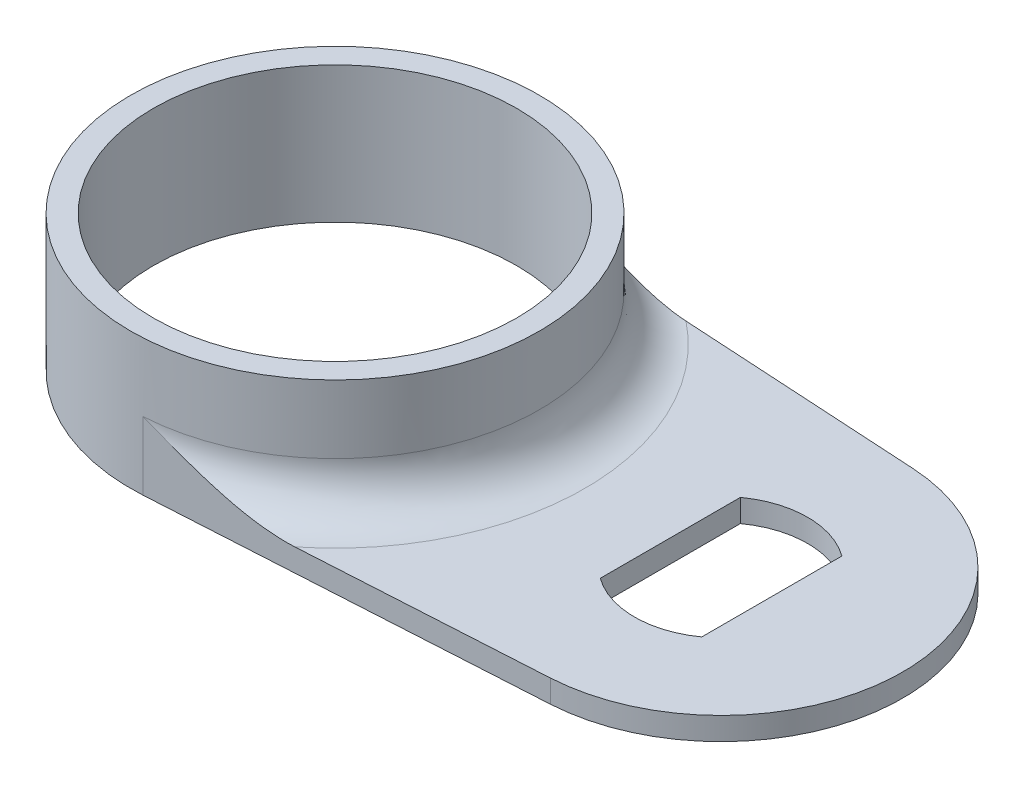
ISO-10303-21;
HEADER;
FILE_DESCRIPTION(('STEP AP214'),'2;1');
FILE_NAME('part.step','',(''),(''),'','','');
FILE_SCHEMA(('AUTOMOTIVE_DESIGN { 1 0 10303 214 1 1 1 1 }'));
ENDSEC;
DATA;
#1=APPLICATION_CONTEXT('core data for automotive mechanical design processes');
#2=APPLICATION_PROTOCOL_DEFINITION('international standard','automotive_design',2000,#1);
#3=PRODUCT_CONTEXT('',#1,'mechanical');
#4=PRODUCT('Part','Part','',(#3));
#5=PRODUCT_RELATED_PRODUCT_CATEGORY('part','',(#4));
#6=PRODUCT_DEFINITION_FORMATION('','',#4);
#7=PRODUCT_DEFINITION_CONTEXT('part definition',#1,'design');
#8=PRODUCT_DEFINITION('design','',#6,#7);
#9=PRODUCT_DEFINITION_SHAPE('','',#8);
#10=(LENGTH_UNIT() NAMED_UNIT(*) SI_UNIT(.MILLI.,.METRE.));
#11=(NAMED_UNIT(*) PLANE_ANGLE_UNIT() SI_UNIT($,.RADIAN.));
#12=(NAMED_UNIT(*) SI_UNIT($,.STERADIAN.) SOLID_ANGLE_UNIT());
#13=UNCERTAINTY_MEASURE_WITH_UNIT(LENGTH_MEASURE(1.E-05),#10,'distance_accuracy_value','');
#14=(GEOMETRIC_REPRESENTATION_CONTEXT(3) GLOBAL_UNCERTAINTY_ASSIGNED_CONTEXT((#13)) GLOBAL_UNIT_ASSIGNED_CONTEXT((#10,
#11,#12)) REPRESENTATION_CONTEXT('',''));
#15=CARTESIAN_POINT('',(0.,0.,0.));
#16=DIRECTION('',(0.,0.,1.));
#17=DIRECTION('',(1.,0.,0.));
#18=AXIS2_PLACEMENT_3D('',#15,#16,#17);
#19=CARTESIAN_POINT('',(-85.,5.,0.));
#20=DIRECTION('',(0.,1.,0.));
#21=DIRECTION('',(0.,0.,1.));
#22=AXIS2_PLACEMENT_3D('',#19,#20,#21);
#23=PLANE('',#22);
#24=DIRECTION('',(-0.998268396969244,0.,-0.0588235294117646));
#25=VECTOR('',#24,1.);
#26=CARTESIAN_POINT('',(-82.3529411764706,5.,-44.922077863616));
#27=LINE('',#26,#25);
#28=CARTESIAN_POINT('',(2.35294117647059,5.,-39.9307358787697));
#29=VERTEX_POINT('',#28);
#30=CARTESIAN_POINT('',(-50.7849226705912,5.,-43.0619145341051));
#31=VERTEX_POINT('',#30);
#32=EDGE_CURVE('E159',#29,#31,#27,.T.);
#33=ORIENTED_EDGE('',*,*,#32,.T.);
#34=CARTESIAN_POINT('',(-85.,5.,0.));
#35=DIRECTION('',(0.,1.,0.));
#36=DIRECTION('',(0.,0.,1.));
#37=AXIS2_PLACEMENT_3D('',#34,#35,#36);
#38=CIRCLE('',#37,55.);
#39=CARTESIAN_POINT('',(-50.7849226705912,5.,43.0619145341051));
#40=VERTEX_POINT('',#39);
#41=EDGE_CURVE('E60',#31,#40,#38,.F.);
#42=ORIENTED_EDGE('',*,*,#41,.T.);
#43=DIRECTION('',(0.998268396969244,0.,-0.0588235294117647));
#44=VECTOR('',#43,1.);
#45=CARTESIAN_POINT('',(-82.3529411764706,5.,44.922077863616));
#46=LINE('',#45,#44);
#47=CARTESIAN_POINT('',(2.35294117647059,5.,39.9307358787697));
#48=VERTEX_POINT('',#47);
#49=EDGE_CURVE('E154',#40,#48,#46,.T.);
#50=ORIENTED_EDGE('',*,*,#49,.T.);
#51=CARTESIAN_POINT('',(0.,5.,0.));
#52=DIRECTION('',(0.,1.,0.));
#53=DIRECTION('',(0.,0.,1.));
#54=AXIS2_PLACEMENT_3D('',#51,#52,#53);
#55=CIRCLE('',#54,40.);
#56=EDGE_CURVE('E156',#48,#29,#55,.T.);
#57=ORIENTED_EDGE('',*,*,#56,.T.);
#58=EDGE_LOOP('',(#33,#42,#50,#57));
#59=FACE_BOUND('',#58,.T.);
#60=DIRECTION('',(0.,0.,1.));
#61=VECTOR('',#60,1.);
#62=CARTESIAN_POINT('',(-11.1790820285031,5.,-15.425));
#63=LINE('',#62,#61);
#64=CARTESIAN_POINT('',(-11.1790820285031,5.,-15.425));
#65=VERTEX_POINT('',#64);
#66=CARTESIAN_POINT('',(-11.1790820285031,5.,15.425));
#67=VERTEX_POINT('',#66);
#68=EDGE_CURVE('E121',#65,#67,#63,.T.);
#69=ORIENTED_EDGE('',*,*,#68,.F.);
#70=CARTESIAN_POINT('',(0.,5.,0.));
#71=DIRECTION('',(0.,1.,0.));
#72=DIRECTION('',(0.,0.,1.));
#73=AXIS2_PLACEMENT_3D('',#70,#71,#72);
#74=CIRCLE('',#73,19.05);
#75=CARTESIAN_POINT('',(11.1790820285031,5.,-15.425));
#76=VERTEX_POINT('',#75);
#77=EDGE_CURVE('E111',#76,#65,#74,.T.);
#78=ORIENTED_EDGE('',*,*,#77,.F.);
#79=DIRECTION('',(0.,0.,-1.));
#80=VECTOR('',#79,1.);
#81=CARTESIAN_POINT('',(11.1790820285031,5.,15.425));
#82=LINE('',#81,#80);
#83=CARTESIAN_POINT('',(11.1790820285031,5.,15.425));
#84=VERTEX_POINT('',#83);
#85=EDGE_CURVE('E136',#84,#76,#82,.T.);
#86=ORIENTED_EDGE('',*,*,#85,.F.);
#87=CARTESIAN_POINT('',(0.,5.,0.));
#88=DIRECTION('',(0.,1.,0.));
#89=DIRECTION('',(0.,0.,1.));
#90=AXIS2_PLACEMENT_3D('',#87,#88,#89);
#91=CIRCLE('',#90,19.05);
#92=EDGE_CURVE('E134',#67,#84,#91,.T.);
#93=ORIENTED_EDGE('',*,*,#92,.F.);
#94=EDGE_LOOP('',(#69,#78,#86,#93));
#95=FACE_BOUND('',#94,.T.);
#96=ADVANCED_FACE('F33',(#59,#95),#23,.T.);
#97=CARTESIAN_POINT('',(-85.,0.,0.));
#98=DIRECTION('',(0.,1.,0.));
#99=DIRECTION('',(0.,0.,1.));
#100=AXIS2_PLACEMENT_3D('',#97,#98,#99);
#101=PLANE('',#100);
#102=CARTESIAN_POINT('',(-85.,0.,0.));
#103=DIRECTION('',(0.,1.,0.));
#104=DIRECTION('',(0.,0.,1.));
#105=AXIS2_PLACEMENT_3D('',#102,#103,#104);
#106=CIRCLE('',#105,45.);
#107=CARTESIAN_POINT('',(-82.3529411764706,0.,-44.922077863616));
#108=VERTEX_POINT('',#107);
#109=CARTESIAN_POINT('',(-82.3529411764706,0.,44.922077863616));
#110=VERTEX_POINT('',#109);
#111=EDGE_CURVE('E129',#108,#110,#106,.T.);
#112=ORIENTED_EDGE('',*,*,#111,.F.);
#113=DIRECTION('',(-0.998268396969244,0.,-0.0588235294117646));
#114=VECTOR('',#113,1.);
#115=CARTESIAN_POINT('',(-82.3529411764706,0.,-44.922077863616));
#116=LINE('',#115,#114);
#117=CARTESIAN_POINT('',(2.35294117647059,0.,-39.9307358787697));
#118=VERTEX_POINT('',#117);
#119=EDGE_CURVE('E157',#118,#108,#116,.T.);
#120=ORIENTED_EDGE('',*,*,#119,.F.);
#121=CARTESIAN_POINT('',(0.,0.,0.));
#122=DIRECTION('',(0.,1.,0.));
#123=DIRECTION('',(0.,0.,1.));
#124=AXIS2_PLACEMENT_3D('',#121,#122,#123);
#125=CIRCLE('',#124,40.);
#126=CARTESIAN_POINT('',(2.35294117647059,0.,39.9307358787697));
#127=VERTEX_POINT('',#126);
#128=EDGE_CURVE('E166',#127,#118,#125,.T.);
#129=ORIENTED_EDGE('',*,*,#128,.F.);
#130=DIRECTION('',(0.998268396969244,0.,-0.0588235294117647));
#131=VECTOR('',#130,1.);
#132=CARTESIAN_POINT('',(-82.3529411764706,0.,44.922077863616));
#133=LINE('',#132,#131);
#134=EDGE_CURVE('E164',#110,#127,#133,.T.);
#135=ORIENTED_EDGE('',*,*,#134,.F.);
#136=EDGE_LOOP('',(#112,#120,#129,#135));
#137=FACE_BOUND('',#136,.T.);
#138=CARTESIAN_POINT('',(0.,0.,0.));
#139=DIRECTION('',(0.,1.,0.));
#140=DIRECTION('',(0.,0.,1.));
#141=AXIS2_PLACEMENT_3D('',#138,#139,#140);
#142=CIRCLE('',#141,19.05);
#143=CARTESIAN_POINT('',(11.1790820285031,0.,-15.425));
#144=VERTEX_POINT('',#143);
#145=CARTESIAN_POINT('',(-11.1790820285031,0.,-15.425));
#146=VERTEX_POINT('',#145);
#147=EDGE_CURVE('E141',#144,#146,#142,.T.);
#148=ORIENTED_EDGE('',*,*,#147,.T.);
#149=DIRECTION('',(0.,0.,1.));
#150=VECTOR('',#149,1.);
#151=CARTESIAN_POINT('',(-11.1790820285031,0.,-15.425));
#152=LINE('',#151,#150);
#153=CARTESIAN_POINT('',(-11.1790820285031,0.,15.425));
#154=VERTEX_POINT('',#153);
#155=EDGE_CURVE('E128',#146,#154,#152,.T.);
#156=ORIENTED_EDGE('',*,*,#155,.T.);
#157=CARTESIAN_POINT('',(0.,0.,0.));
#158=DIRECTION('',(0.,1.,0.));
#159=DIRECTION('',(0.,0.,1.));
#160=AXIS2_PLACEMENT_3D('',#157,#158,#159);
#161=CIRCLE('',#160,19.05);
#162=CARTESIAN_POINT('',(11.1790820285031,0.,15.425));
#163=VERTEX_POINT('',#162);
#164=EDGE_CURVE('E145',#154,#163,#161,.T.);
#165=ORIENTED_EDGE('',*,*,#164,.T.);
#166=DIRECTION('',(0.,0.,-1.));
#167=VECTOR('',#166,1.);
#168=CARTESIAN_POINT('',(11.1790820285031,0.,15.425));
#169=LINE('',#168,#167);
#170=EDGE_CURVE('E122',#163,#144,#169,.T.);
#171=ORIENTED_EDGE('',*,*,#170,.T.);
#172=EDGE_LOOP('',(#148,#156,#165,#171));
#173=FACE_BOUND('',#172,.T.);
#174=CARTESIAN_POINT('',(-85.,0.,0.));
#175=DIRECTION('',(0.,1.,0.));
#176=DIRECTION('',(0.,0.,1.));
#177=AXIS2_PLACEMENT_3D('',#174,#175,#176);
#178=CIRCLE('',#177,40.);
#179=CARTESIAN_POINT('',(-85.,0.,40.));
#180=VERTEX_POINT('',#179);
#181=EDGE_CURVE('E143',#180,#180,#178,.T.);
#182=ORIENTED_EDGE('',*,*,#181,.T.);
#183=EDGE_LOOP('',(#182));
#184=FACE_BOUND('',#183,.T.);
#185=ADVANCED_FACE('F194',(#137,#173,#184),#101,.F.);
#186=CARTESIAN_POINT('',(-85.,5.,0.));
#187=DIRECTION('',(0.,-1.,0.));
#188=DIRECTION('',(0.,0.,-1.));
#189=AXIS2_PLACEMENT_3D('',#186,#187,#188);
#190=CYLINDRICAL_SURFACE('',#189,45.);
#191=CARTESIAN_POINT('',(-85.,15.,0.));
#192=DIRECTION('',(0.,1.,0.));
#193=DIRECTION('',(0.,0.,1.));
#194=AXIS2_PLACEMENT_3D('',#191,#192,#193);
#195=CIRCLE('',#194,45.);
#196=CARTESIAN_POINT('',(-82.3529411764706,15.,44.922077863616));
#197=VERTEX_POINT('',#196);
#198=CARTESIAN_POINT('',(-82.3529411764706,15.,-44.922077863616));
#199=VERTEX_POINT('',#198);
#200=EDGE_CURVE('E180',#197,#199,#195,.T.);
#201=ORIENTED_EDGE('',*,*,#200,.T.);
#202=DIRECTION('',(0.,-1.,0.));
#203=VECTOR('',#202,1.);
#204=CARTESIAN_POINT('',(-82.3529411764706,5.,-44.922077863616));
#205=LINE('',#204,#203);
#206=EDGE_CURVE('E161',#199,#108,#205,.T.);
#207=ORIENTED_EDGE('',*,*,#206,.T.);
#208=ORIENTED_EDGE('',*,*,#111,.T.);
#209=DIRECTION('',(0.,-1.,0.));
#210=VECTOR('',#209,1.);
#211=CARTESIAN_POINT('',(-82.3529411764706,5.,44.922077863616));
#212=LINE('',#211,#210);
#213=EDGE_CURVE('E177',#197,#110,#212,.T.);
#214=ORIENTED_EDGE('',*,*,#213,.F.);
#215=EDGE_LOOP('',(#201,#207,#208,#214));
#216=FACE_BOUND('',#215,.T.);
#217=CARTESIAN_POINT('',(-85.,30.,0.));
#218=DIRECTION('',(0.,1.,0.));
#219=DIRECTION('',(0.,0.,1.));
#220=AXIS2_PLACEMENT_3D('',#217,#218,#219);
#221=CIRCLE('',#220,45.);
#222=CARTESIAN_POINT('',(-85.,30.,45.));
#223=VERTEX_POINT('',#222);
#224=EDGE_CURVE('E240',#223,#223,#221,.T.);
#225=ORIENTED_EDGE('',*,*,#224,.F.);
#226=EDGE_LOOP('',(#225));
#227=FACE_BOUND('',#226,.T.);
#228=ADVANCED_FACE('F201',(#216,#227),#190,.T.);
#229=CARTESIAN_POINT('',(-82.3529411764706,5.,44.922077863616));
#230=DIRECTION('',(-0.0588235294117647,0.,-0.998268396969244));
#231=DIRECTION('',(-0.998268396969244,0.,0.0588235294117647));
#232=AXIS2_PLACEMENT_3D('',#229,#230,#231);
#233=PLANE('',#232);
#234=ORIENTED_EDGE('',*,*,#134,.T.);
#235=DIRECTION('',(0.,-1.,0.));
#236=VECTOR('',#235,1.);
#237=CARTESIAN_POINT('',(2.35294117647059,5.,39.9307358787697));
#238=LINE('',#237,#236);
#239=EDGE_CURVE('E174',#48,#127,#238,.T.);
#240=ORIENTED_EDGE('',*,*,#239,.F.);
#241=ORIENTED_EDGE('',*,*,#49,.F.);
#242=CARTESIAN_POINT('',(-50.7849226705912,5.,43.0619145341051));
#243=CARTESIAN_POINT('',(-51.07127392791,5.0000039839609,43.0787879437594));
#244=CARTESIAN_POINT('',(-51.3576027062524,5.00407965986606,43.0956600288273));
#245=CARTESIAN_POINT('',(-51.930021403472,5.01995827800982,43.1293901240342));
#246=CARTESIAN_POINT('',(-52.2161113423793,5.03176048936591,43.1462481353534));
#247=CARTESIAN_POINT('',(-53.0734577657511,5.0781148574327,43.1967677578361));
#248=CARTESIAN_POINT('',(-53.6441473941757,5.12361579266139,43.2303959666871));
#249=CARTESIAN_POINT('',(-54.7811192067368,5.24064224992738,43.2973926732437));
#250=CARTESIAN_POINT('',(-55.3474093668598,5.31209206375101,43.3307616409389));
#251=CARTESIAN_POINT('',(-56.4766228392769,5.47838498331519,43.3973011829183));
#252=CARTESIAN_POINT('',(-57.0395456000933,5.57323181885659,43.4304717247065));
#253=CARTESIAN_POINT('',(-58.1546650008146,5.78263949188636,43.4961807655467));
#254=CARTESIAN_POINT('',(-58.7069090892008,5.89694851405206,43.5287220605274));
#255=CARTESIAN_POINT('',(-59.8072986121974,6.1439691365389,43.5935631349988));
#256=CARTESIAN_POINT('',(-60.3554436690129,6.27668241161763,43.6258628922278));
#257=CARTESIAN_POINT('',(-61.9942950670852,6.69973461732017,43.7224331369723));
#258=CARTESIAN_POINT('',(-63.0786798932216,7.01484225733573,43.7863311256371));
#259=CARTESIAN_POINT('',(-64.9360933599235,7.60414710698417,43.8957802637848));
#260=CARTESIAN_POINT('',(-65.713136690904,7.86595005839312,43.9415679811691));
#261=CARTESIAN_POINT('',(-67.2590486997179,8.412887035449,44.0326617198816));
#262=CARTESIAN_POINT('',(-68.0279168743145,8.69802248808349,44.0779677115562));
#263=CARTESIAN_POINT('',(-69.5581436323627,9.28753446461466,44.1681371880037));
#264=CARTESIAN_POINT('',(-70.3195028592462,9.59190932305775,44.213000710691));
#265=CARTESIAN_POINT('',(-71.8358336310923,10.216272432596,44.3023513582989));
#266=CARTESIAN_POINT('',(-72.590804867416,10.5362614330986,44.3468384650326));
#267=CARTESIAN_POINT('',(-74.8527596163319,11.5166273886488,44.4801254268406));
#268=CARTESIAN_POINT('',(-76.3517559474309,12.1954148359654,44.5684546327317));
#269=CARTESIAN_POINT('',(-79.3387257014215,13.5767378334647,44.7444635134189));
#270=CARTESIAN_POINT('',(-80.8266982778496,14.2792751847179,44.8321431383367));
#271=CARTESIAN_POINT('',(-82.3274013914002,14.9879395464988,44.9205729173482));
#272=CARTESIAN_POINT('',(-82.3401712836371,14.9939697733995,44.9213253904645));
#273=CARTESIAN_POINT('',(-82.3529411764706,15.,44.922077863616));
#274=B_SPLINE_CURVE_WITH_KNOTS('',3,(#242,#243,#244,#245,#246,#247,#248,#249,#250,#251,#252,
#253,#254,#255,#256,#257,#258,#259,#260,#261,#262,#263,#264,#265,#266,#267,#268,#269,#270,#271,
#272,#273),.UNSPECIFIED.,.F.,.F.,(4,2,2,2,2,2,2,2,2,2,2,2,2,2,2,4),(0.,0.860476727147888,
1.72087207027274,3.44059261867407,5.15533551219946,6.87035193572028,8.56466424763826,
10.2591308405629,13.6503186246873,16.1136941408424,18.5772204268263,21.040533749646,
23.5039654167536,28.4470649294398,33.3905401459719,33.4329665528433),.UNSPECIFIED.);
#275=EDGE_CURVE('E11',#40,#197,#274,.T.);
#276=ORIENTED_EDGE('',*,*,#275,.T.);
#277=ORIENTED_EDGE('',*,*,#213,.T.);
#278=EDGE_LOOP('',(#234,#240,#241,#276,#277));
#279=FACE_BOUND('',#278,.T.);
#280=ADVANCED_FACE('F197',(#279),#233,.F.);
#281=CARTESIAN_POINT('',(0.,5.,0.));
#282=DIRECTION('',(0.,-1.,0.));
#283=DIRECTION('',(0.,0.,-1.));
#284=AXIS2_PLACEMENT_3D('',#281,#282,#283);
#285=CYLINDRICAL_SURFACE('',#284,40.);
#286=ORIENTED_EDGE('',*,*,#128,.T.);
#287=DIRECTION('',(0.,-1.,0.));
#288=VECTOR('',#287,1.);
#289=CARTESIAN_POINT('',(2.35294117647059,5.,-39.9307358787697));
#290=LINE('',#289,#288);
#291=EDGE_CURVE('E171',#29,#118,#290,.T.);
#292=ORIENTED_EDGE('',*,*,#291,.F.);
#293=ORIENTED_EDGE('',*,*,#56,.F.);
#294=ORIENTED_EDGE('',*,*,#239,.T.);
#295=EDGE_LOOP('',(#286,#292,#293,#294));
#296=FACE_BOUND('',#295,.T.);
#297=ADVANCED_FACE('F193',(#296),#285,.T.);
#298=CARTESIAN_POINT('',(-82.3529411764706,5.,-44.922077863616));
#299=DIRECTION('',(-0.0588235294117646,0.,0.998268396969244));
#300=DIRECTION('',(0.998268396969244,0.,0.0588235294117646));
#301=AXIS2_PLACEMENT_3D('',#298,#299,#300);
#302=PLANE('',#301);
#303=ORIENTED_EDGE('',*,*,#119,.T.);
#304=ORIENTED_EDGE('',*,*,#206,.F.);
#305=CARTESIAN_POINT('',(-50.7849226705912,5.,-43.0619145341051));
#306=CARTESIAN_POINT('',(-51.0712739279108,5.0000039839609,-43.0787879437595));
#307=CARTESIAN_POINT('',(-51.357602706254,5.00407965986608,-43.0956600288274));
#308=CARTESIAN_POINT('',(-51.9300214034752,5.01995827800994,-43.1293901240344));
#309=CARTESIAN_POINT('',(-52.2161113423833,5.03176048936609,-43.1462481353536));
#310=CARTESIAN_POINT('',(-53.0734577657576,5.07811485743313,-43.1967677578364));
#311=CARTESIAN_POINT('',(-53.6441473941838,5.12361579266207,-43.2303959666875));
#312=CARTESIAN_POINT('',(-54.7811192067478,5.24064224992866,-43.2973926732444));
#313=CARTESIAN_POINT('',(-55.347409366872,5.31209206375262,-43.3307616409396));
#314=CARTESIAN_POINT('',(-56.4766228392917,5.47838498331755,-43.3973011829192));
#315=CARTESIAN_POINT('',(-57.0395456001092,5.57323181885937,-43.4304717247074));
#316=CARTESIAN_POINT('',(-58.1546650008301,5.7826394918895,-43.4961807655476));
#317=CARTESIAN_POINT('',(-58.7069090892148,5.89694851405507,-43.5287220605282));
#318=CARTESIAN_POINT('',(-59.8072986122084,6.14396913654151,-43.5935631349995));
#319=CARTESIAN_POINT('',(-60.3554436690223,6.27668241161998,-43.6258628922284));
#320=CARTESIAN_POINT('',(-61.9942950670904,6.69973461732169,-43.7224331369726));
#321=CARTESIAN_POINT('',(-63.0786798932241,7.01484225733655,-43.7863311256372));
#322=CARTESIAN_POINT('',(-64.9360933599233,7.60414710698408,-43.8957802637847));
#323=CARTESIAN_POINT('',(-65.7131366909035,7.86595005839293,-43.9415679811691));
#324=CARTESIAN_POINT('',(-67.259048699717,8.4128870354487,-44.0326617198815));
#325=CARTESIAN_POINT('',(-68.0279168743134,8.69802248808319,-44.0779677115562));
#326=CARTESIAN_POINT('',(-69.558143632361,9.28753446461388,-44.1681371880036));
#327=CARTESIAN_POINT('',(-70.319502859244,9.59190932305646,-44.2130007106909));
#328=CARTESIAN_POINT('',(-71.8358336310887,10.2162724325949,-44.3023513582986));
#329=CARTESIAN_POINT('',(-72.5908048674115,10.5362614330983,-44.3468384650324));
#330=CARTESIAN_POINT('',(-74.8527596163294,11.5166273886445,-44.4801254268405));
#331=CARTESIAN_POINT('',(-76.3517559474345,12.1954148359493,-44.568454632732));
#332=CARTESIAN_POINT('',(-79.3387257014127,13.5767378334786,-44.7444635134183));
#333=CARTESIAN_POINT('',(-80.8266982778222,14.2792751847735,-44.8321431383347));
#334=CARTESIAN_POINT('',(-82.3274013913996,14.9879395464997,-44.9205729173481));
#335=CARTESIAN_POINT('',(-82.3401712836368,14.9939697733999,-44.9213253904645));
#336=CARTESIAN_POINT('',(-82.3529411764706,15.,-44.922077863616));
#337=B_SPLINE_CURVE_WITH_KNOTS('',3,(#305,#306,#307,#308,#309,#310,#311,#312,#313,#314,#315,
#316,#317,#318,#319,#320,#321,#322,#323,#324,#325,#326,#327,#328,#329,#330,#331,#332,#333,#334,
#335,#336),.UNSPECIFIED.,.F.,.F.,(4,2,2,2,2,2,2,2,2,2,2,2,2,2,2,4),(0.,0.860476727150342,
1.72087207027764,3.44059261868387,5.1553355122131,6.87035193573775,8.56466424765108,
10.259130840571,13.6503186246873,16.1136941408416,18.577220426825,21.0405337496429,
23.5039654167489,28.4470649294369,33.3905401459717,33.4329665528433),.UNSPECIFIED.);
#338=EDGE_CURVE('E47',#199,#31,#337,.F.);
#339=ORIENTED_EDGE('',*,*,#338,.T.);
#340=ORIENTED_EDGE('',*,*,#32,.F.);
#341=ORIENTED_EDGE('',*,*,#291,.T.);
#342=EDGE_LOOP('',(#303,#304,#339,#340,#341));
#343=FACE_BOUND('',#342,.T.);
#344=ADVANCED_FACE('F188',(#343),#302,.F.);
#345=CARTESIAN_POINT('',(0.,5.,0.));
#346=DIRECTION('',(0.,-1.,0.));
#347=DIRECTION('',(0.,0.,-1.));
#348=AXIS2_PLACEMENT_3D('',#345,#346,#347);
#349=CYLINDRICAL_SURFACE('',#348,19.05);
#350=ORIENTED_EDGE('',*,*,#147,.F.);
#351=DIRECTION('',(0.,-1.,0.));
#352=VECTOR('',#351,1.);
#353=CARTESIAN_POINT('',(11.1790820285031,5.,-15.425));
#354=LINE('',#353,#352);
#355=EDGE_CURVE('E117',#76,#144,#354,.T.);
#356=ORIENTED_EDGE('',*,*,#355,.F.);
#357=ORIENTED_EDGE('',*,*,#77,.T.);
#358=DIRECTION('',(0.,-1.,0.));
#359=VECTOR('',#358,1.);
#360=CARTESIAN_POINT('',(-11.1790820285031,5.,-15.425));
#361=LINE('',#360,#359);
#362=EDGE_CURVE('E114',#65,#146,#361,.T.);
#363=ORIENTED_EDGE('',*,*,#362,.T.);
#364=EDGE_LOOP('',(#350,#356,#357,#363));
#365=FACE_BOUND('',#364,.T.);
#366=ADVANCED_FACE('F113',(#365),#349,.F.);
#367=CARTESIAN_POINT('',(-11.1790820285031,5.,-15.425));
#368=DIRECTION('',(1.,0.,0.));
#369=DIRECTION('',(0.,0.,-1.));
#370=AXIS2_PLACEMENT_3D('',#367,#368,#369);
#371=PLANE('',#370);
#372=ORIENTED_EDGE('',*,*,#155,.F.);
#373=ORIENTED_EDGE('',*,*,#362,.F.);
#374=ORIENTED_EDGE('',*,*,#68,.T.);
#375=DIRECTION('',(0.,-1.,0.));
#376=VECTOR('',#375,1.);
#377=CARTESIAN_POINT('',(-11.1790820285031,5.,15.425));
#378=LINE('',#377,#376);
#379=EDGE_CURVE('E130',#67,#154,#378,.T.);
#380=ORIENTED_EDGE('',*,*,#379,.T.);
#381=EDGE_LOOP('',(#372,#373,#374,#380));
#382=FACE_BOUND('',#381,.T.);
#383=ADVANCED_FACE('F125',(#382),#371,.T.);
#384=CARTESIAN_POINT('',(0.,5.,0.));
#385=DIRECTION('',(0.,-1.,0.));
#386=DIRECTION('',(0.,0.,-1.));
#387=AXIS2_PLACEMENT_3D('',#384,#385,#386);
#388=CYLINDRICAL_SURFACE('',#387,19.05);
#389=ORIENTED_EDGE('',*,*,#164,.F.);
#390=ORIENTED_EDGE('',*,*,#379,.F.);
#391=ORIENTED_EDGE('',*,*,#92,.T.);
#392=DIRECTION('',(0.,-1.,0.));
#393=VECTOR('',#392,1.);
#394=CARTESIAN_POINT('',(11.1790820285031,5.,15.425));
#395=LINE('',#394,#393);
#396=EDGE_CURVE('E151',#84,#163,#395,.T.);
#397=ORIENTED_EDGE('',*,*,#396,.T.);
#398=EDGE_LOOP('',(#389,#390,#391,#397));
#399=FACE_BOUND('',#398,.T.);
#400=ADVANCED_FACE('F221',(#399),#388,.F.);
#401=CARTESIAN_POINT('',(11.1790820285031,5.,15.425));
#402=DIRECTION('',(-1.,0.,0.));
#403=DIRECTION('',(0.,0.,1.));
#404=AXIS2_PLACEMENT_3D('',#401,#402,#403);
#405=PLANE('',#404);
#406=ORIENTED_EDGE('',*,*,#170,.F.);
#407=ORIENTED_EDGE('',*,*,#396,.F.);
#408=ORIENTED_EDGE('',*,*,#85,.T.);
#409=ORIENTED_EDGE('',*,*,#355,.T.);
#410=EDGE_LOOP('',(#406,#407,#408,#409));
#411=FACE_BOUND('',#410,.T.);
#412=ADVANCED_FACE('F224',(#411),#405,.T.);
#413=CARTESIAN_POINT('',(-85.,5.,0.));
#414=DIRECTION('',(0.,-1.,0.));
#415=DIRECTION('',(0.,0.,-1.));
#416=AXIS2_PLACEMENT_3D('',#413,#414,#415);
#417=CYLINDRICAL_SURFACE('',#416,40.);
#418=ORIENTED_EDGE('',*,*,#181,.F.);
#419=EDGE_LOOP('',(#418));
#420=FACE_BOUND('',#419,.T.);
#421=CARTESIAN_POINT('',(-85.,30.,0.));
#422=DIRECTION('',(0.,1.,0.));
#423=DIRECTION('',(0.,0.,1.));
#424=AXIS2_PLACEMENT_3D('',#421,#422,#423);
#425=CIRCLE('',#424,40.);
#426=CARTESIAN_POINT('',(-85.,30.,40.));
#427=VERTEX_POINT('',#426);
#428=EDGE_CURVE('E243',#427,#427,#425,.T.);
#429=ORIENTED_EDGE('',*,*,#428,.T.);
#430=EDGE_LOOP('',(#429));
#431=FACE_BOUND('',#430,.T.);
#432=ADVANCED_FACE('F227',(#420,#431),#417,.F.);
#433=CARTESIAN_POINT('',(-85.,30.,0.));
#434=DIRECTION('',(0.,1.,0.));
#435=DIRECTION('',(0.,0.,1.));
#436=AXIS2_PLACEMENT_3D('',#433,#434,#435);
#437=PLANE('',#436);
#438=ORIENTED_EDGE('',*,*,#224,.T.);
#439=EDGE_LOOP('',(#438));
#440=FACE_BOUND('',#439,.T.);
#441=ORIENTED_EDGE('',*,*,#428,.F.);
#442=EDGE_LOOP('',(#441));
#443=FACE_BOUND('',#442,.T.);
#444=ADVANCED_FACE('F230',(#440,#443),#437,.T.);
#445=CARTESIAN_POINT('',(-85.,15.,0.));
#446=DIRECTION('',(0.,1.,0.));
#447=DIRECTION('',(0.,0.,1.));
#448=AXIS2_PLACEMENT_3D('',#445,#446,#447);
#449=TOROIDAL_SURFACE('',#448,55.,10.);
#450=ORIENTED_EDGE('',*,*,#275,.F.);
#451=ORIENTED_EDGE('',*,*,#41,.F.);
#452=ORIENTED_EDGE('',*,*,#338,.F.);
#453=ORIENTED_EDGE('',*,*,#200,.F.);
#454=EDGE_LOOP('',(#450,#451,#452,#453));
#455=FACE_BOUND('',#454,.T.);
#456=ADVANCED_FACE('F35',(#455),#449,.F.);
#457=CLOSED_SHELL('',(#96,#185,#228,#280,#297,#344,#366,#383,#400,#412,#432,#444,#456));
#458=MANIFOLD_SOLID_BREP('B2',#457);
#459=ADVANCED_BREP_SHAPE_REPRESENTATION('',(#18,#458),#14);
#460=SHAPE_DEFINITION_REPRESENTATION(#9,#459);
ENDSEC;
END-ISO-10303-21;
